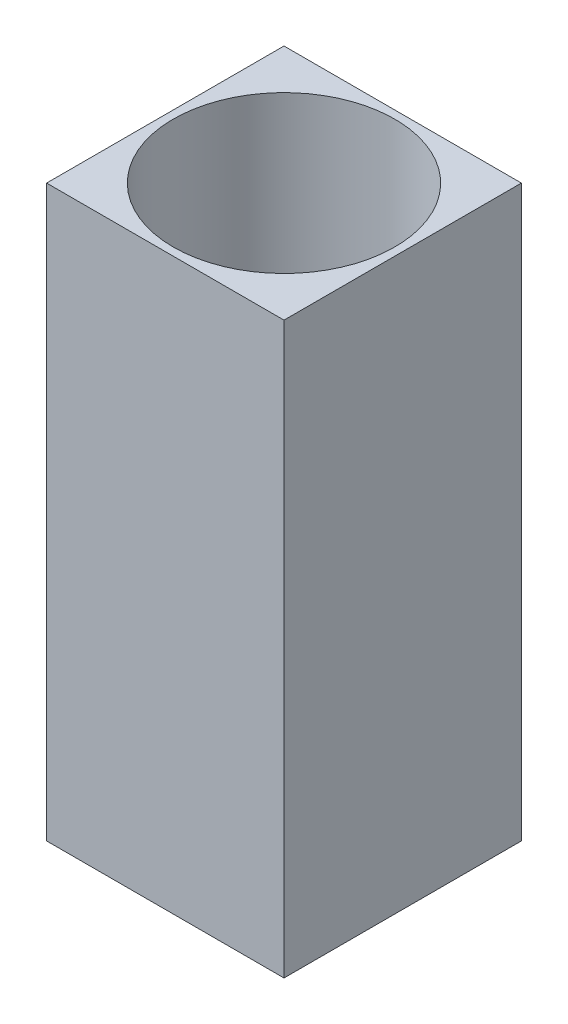
ISO-10303-21;
HEADER;
FILE_DESCRIPTION(('STEP AP214'),'2;1');
FILE_NAME('part.step','',(''),(''),'','','');
FILE_SCHEMA(('AUTOMOTIVE_DESIGN { 1 0 10303 214 1 1 1 1 }'));
ENDSEC;
DATA;
#1=APPLICATION_CONTEXT('core data for automotive mechanical design processes');
#2=APPLICATION_PROTOCOL_DEFINITION('international standard','automotive_design',2000,#1);
#3=PRODUCT_CONTEXT('',#1,'mechanical');
#4=PRODUCT('Part','Part','',(#3));
#5=PRODUCT_RELATED_PRODUCT_CATEGORY('part','',(#4));
#6=PRODUCT_DEFINITION_FORMATION('','',#4);
#7=PRODUCT_DEFINITION_CONTEXT('part definition',#1,'design');
#8=PRODUCT_DEFINITION('design','',#6,#7);
#9=PRODUCT_DEFINITION_SHAPE('','',#8);
#10=(LENGTH_UNIT() NAMED_UNIT(*) SI_UNIT(.MILLI.,.METRE.));
#11=(NAMED_UNIT(*) PLANE_ANGLE_UNIT() SI_UNIT($,.RADIAN.));
#12=(NAMED_UNIT(*) SI_UNIT($,.STERADIAN.) SOLID_ANGLE_UNIT());
#13=UNCERTAINTY_MEASURE_WITH_UNIT(LENGTH_MEASURE(1.E-05),#10,'distance_accuracy_value','');
#14=(GEOMETRIC_REPRESENTATION_CONTEXT(3) GLOBAL_UNCERTAINTY_ASSIGNED_CONTEXT((#13)) GLOBAL_UNIT_ASSIGNED_CONTEXT((#10,
#11,#12)) REPRESENTATION_CONTEXT('',''));
#15=CARTESIAN_POINT('',(0.,0.,0.));
#16=DIRECTION('',(0.,0.,1.));
#17=DIRECTION('',(1.,0.,0.));
#18=AXIS2_PLACEMENT_3D('',#15,#16,#17);
#19=CARTESIAN_POINT('',(0.,215.9,0.));
#20=DIRECTION('',(1.,0.,0.));
#21=DIRECTION('',(0.,0.,-1.));
#22=AXIS2_PLACEMENT_3D('',#19,#20,#21);
#23=PLANE('',#22);
#24=DIRECTION('',(0.,-1.,0.));
#25=VECTOR('',#24,1.);
#26=CARTESIAN_POINT('',(0.,215.9,-95.25));
#27=LINE('',#26,#25);
#28=CARTESIAN_POINT('',(0.,222.25,-95.25));
#29=VERTEX_POINT('',#28);
#30=CARTESIAN_POINT('',(0.,-6.35,-95.25));
#31=VERTEX_POINT('',#30);
#32=EDGE_CURVE('E76',#29,#31,#27,.T.);
#33=ORIENTED_EDGE('',*,*,#32,.T.);
#34=DIRECTION('',(0.,0.,-1.));
#35=VECTOR('',#34,1.);
#36=CARTESIAN_POINT('',(0.,-6.35,0.));
#37=LINE('',#36,#35);
#38=CARTESIAN_POINT('',(0.,-6.35,0.));
#39=VERTEX_POINT('',#38);
#40=EDGE_CURVE('E107',#39,#31,#37,.T.);
#41=ORIENTED_EDGE('',*,*,#40,.F.);
#42=DIRECTION('',(0.,-1.,0.));
#43=VECTOR('',#42,1.);
#44=CARTESIAN_POINT('',(0.,215.9,0.));
#45=LINE('',#44,#43);
#46=CARTESIAN_POINT('',(0.,222.25,0.));
#47=VERTEX_POINT('',#46);
#48=EDGE_CURVE('E11',#47,#39,#45,.T.);
#49=ORIENTED_EDGE('',*,*,#48,.F.);
#50=DIRECTION('',(0.,0.,1.));
#51=VECTOR('',#50,1.);
#52=CARTESIAN_POINT('',(0.,222.25,-95.25));
#53=LINE('',#52,#51);
#54=EDGE_CURVE('E86',#29,#47,#53,.T.);
#55=ORIENTED_EDGE('',*,*,#54,.F.);
#56=EDGE_LOOP('',(#33,#41,#49,#55));
#57=FACE_BOUND('',#56,.T.);
#58=ADVANCED_FACE('F39',(#57),#23,.F.);
#59=CARTESIAN_POINT('',(0.,215.9,0.));
#60=DIRECTION('',(0.,0.,-1.));
#61=DIRECTION('',(-1.,0.,0.));
#62=AXIS2_PLACEMENT_3D('',#59,#60,#61);
#63=PLANE('',#62);
#64=ORIENTED_EDGE('',*,*,#48,.T.);
#65=DIRECTION('',(-1.,0.,0.));
#66=VECTOR('',#65,1.);
#67=CARTESIAN_POINT('',(95.25,-6.35,0.));
#68=LINE('',#67,#66);
#69=CARTESIAN_POINT('',(95.25,-6.35,0.));
#70=VERTEX_POINT('',#69);
#71=EDGE_CURVE('E104',#70,#39,#68,.T.);
#72=ORIENTED_EDGE('',*,*,#71,.F.);
#73=DIRECTION('',(0.,-1.,0.));
#74=VECTOR('',#73,1.);
#75=CARTESIAN_POINT('',(95.25,215.9,0.));
#76=LINE('',#75,#74);
#77=CARTESIAN_POINT('',(95.25,222.25,0.));
#78=VERTEX_POINT('',#77);
#79=EDGE_CURVE('E46',#78,#70,#76,.T.);
#80=ORIENTED_EDGE('',*,*,#79,.F.);
#81=DIRECTION('',(1.,0.,0.));
#82=VECTOR('',#81,1.);
#83=CARTESIAN_POINT('',(0.,222.25,0.));
#84=LINE('',#83,#82);
#85=EDGE_CURVE('E95',#47,#78,#84,.T.);
#86=ORIENTED_EDGE('',*,*,#85,.F.);
#87=EDGE_LOOP('',(#64,#72,#80,#86));
#88=FACE_BOUND('',#87,.T.);
#89=ADVANCED_FACE('F138',(#88),#63,.F.);
#90=CARTESIAN_POINT('',(95.25,215.9,0.));
#91=DIRECTION('',(-1.,0.,0.));
#92=DIRECTION('',(0.,0.,1.));
#93=AXIS2_PLACEMENT_3D('',#90,#91,#92);
#94=PLANE('',#93);
#95=ORIENTED_EDGE('',*,*,#79,.T.);
#96=DIRECTION('',(0.,0.,1.));
#97=VECTOR('',#96,1.);
#98=CARTESIAN_POINT('',(95.25,-6.35,-95.25));
#99=LINE('',#98,#97);
#100=CARTESIAN_POINT('',(95.25,-6.35,-95.25));
#101=VERTEX_POINT('',#100);
#102=EDGE_CURVE('E112',#101,#70,#99,.T.);
#103=ORIENTED_EDGE('',*,*,#102,.F.);
#104=DIRECTION('',(0.,-1.,0.));
#105=VECTOR('',#104,1.);
#106=CARTESIAN_POINT('',(95.25,215.9,-95.25));
#107=LINE('',#106,#105);
#108=CARTESIAN_POINT('',(95.25,222.25,-95.25));
#109=VERTEX_POINT('',#108);
#110=EDGE_CURVE('E58',#109,#101,#107,.T.);
#111=ORIENTED_EDGE('',*,*,#110,.F.);
#112=DIRECTION('',(0.,0.,-1.));
#113=VECTOR('',#112,1.);
#114=CARTESIAN_POINT('',(95.25,222.25,0.));
#115=LINE('',#114,#113);
#116=EDGE_CURVE('E100',#78,#109,#115,.T.);
#117=ORIENTED_EDGE('',*,*,#116,.F.);
#118=EDGE_LOOP('',(#95,#103,#111,#117));
#119=FACE_BOUND('',#118,.T.);
#120=ADVANCED_FACE('F139',(#119),#94,.F.);
#121=CARTESIAN_POINT('',(0.,215.9,-95.25));
#122=DIRECTION('',(0.,0.,1.));
#123=DIRECTION('',(1.,0.,0.));
#124=AXIS2_PLACEMENT_3D('',#121,#122,#123);
#125=PLANE('',#124);
#126=ORIENTED_EDGE('',*,*,#110,.T.);
#127=DIRECTION('',(1.,0.,0.));
#128=VECTOR('',#127,1.);
#129=CARTESIAN_POINT('',(0.,-6.35,-95.25));
#130=LINE('',#129,#128);
#131=EDGE_CURVE('E83',#31,#101,#130,.T.);
#132=ORIENTED_EDGE('',*,*,#131,.F.);
#133=ORIENTED_EDGE('',*,*,#32,.F.);
#134=DIRECTION('',(-1.,0.,0.));
#135=VECTOR('',#134,1.);
#136=CARTESIAN_POINT('',(95.25,222.25,-95.25));
#137=LINE('',#136,#135);
#138=EDGE_CURVE('E80',#109,#29,#137,.T.);
#139=ORIENTED_EDGE('',*,*,#138,.F.);
#140=EDGE_LOOP('',(#126,#132,#133,#139));
#141=FACE_BOUND('',#140,.T.);
#142=ADVANCED_FACE('F79',(#141),#125,.F.);
#143=CARTESIAN_POINT('',(0.,-6.35,0.));
#144=DIRECTION('',(0.,-1.,0.));
#145=DIRECTION('',(0.,0.,-1.));
#146=AXIS2_PLACEMENT_3D('',#143,#144,#145);
#147=PLANE('',#146);
#148=ORIENTED_EDGE('',*,*,#71,.T.);
#149=ORIENTED_EDGE('',*,*,#40,.T.);
#150=ORIENTED_EDGE('',*,*,#131,.T.);
#151=ORIENTED_EDGE('',*,*,#102,.T.);
#152=EDGE_LOOP('',(#148,#149,#150,#151));
#153=FACE_BOUND('',#152,.T.);
#154=ADVANCED_FACE('F124',(#153),#147,.T.);
#155=CARTESIAN_POINT('',(0.,222.25,0.));
#156=DIRECTION('',(0.,1.,0.));
#157=DIRECTION('',(0.,0.,1.));
#158=AXIS2_PLACEMENT_3D('',#155,#156,#157);
#159=PLANE('',#158);
#160=ORIENTED_EDGE('',*,*,#138,.T.);
#161=ORIENTED_EDGE('',*,*,#54,.T.);
#162=ORIENTED_EDGE('',*,*,#85,.T.);
#163=ORIENTED_EDGE('',*,*,#116,.T.);
#164=EDGE_LOOP('',(#160,#161,#162,#163));
#165=FACE_BOUND('',#164,.T.);
#166=CARTESIAN_POINT('',(47.625,222.25,-47.625));
#167=DIRECTION('',(0.,1.,0.));
#168=DIRECTION('',(0.,0.,1.));
#169=AXIS2_PLACEMENT_3D('',#166,#167,#168);
#170=CIRCLE('',#169,44.45);
#171=CARTESIAN_POINT('',(47.625,222.25,-3.17499999999998));
#172=VERTEX_POINT('',#171);
#173=EDGE_CURVE('E98',#172,#172,#170,.T.);
#174=ORIENTED_EDGE('',*,*,#173,.F.);
#175=EDGE_LOOP('',(#174));
#176=FACE_BOUND('',#175,.T.);
#177=ADVANCED_FACE('F92',(#165,#176),#159,.T.);
#178=CARTESIAN_POINT('',(0.,0.,0.));
#179=DIRECTION('',(0.,-1.,0.));
#180=DIRECTION('',(0.,0.,-1.));
#181=AXIS2_PLACEMENT_3D('',#178,#179,#180);
#182=PLANE('',#181);
#183=CARTESIAN_POINT('',(47.625,0.,-47.625));
#184=DIRECTION('',(0.,1.,0.));
#185=DIRECTION('',(0.,0.,1.));
#186=AXIS2_PLACEMENT_3D('',#183,#184,#185);
#187=CIRCLE('',#186,44.45);
#188=CARTESIAN_POINT('',(47.625,0.,-3.17499999999998));
#189=VERTEX_POINT('',#188);
#190=EDGE_CURVE('E84',#189,#189,#187,.T.);
#191=ORIENTED_EDGE('',*,*,#190,.T.);
#192=EDGE_LOOP('',(#191));
#193=FACE_BOUND('',#192,.T.);
#194=ADVANCED_FACE('F117',(#193),#182,.F.);
#195=CARTESIAN_POINT('',(47.625,215.9,-47.625));
#196=DIRECTION('',(0.,-1.,0.));
#197=DIRECTION('',(0.,0.,-1.));
#198=AXIS2_PLACEMENT_3D('',#195,#196,#197);
#199=CYLINDRICAL_SURFACE('',#198,44.45);
#200=ORIENTED_EDGE('',*,*,#190,.F.);
#201=EDGE_LOOP('',(#200));
#202=FACE_BOUND('',#201,.T.);
#203=ORIENTED_EDGE('',*,*,#173,.T.);
#204=EDGE_LOOP('',(#203));
#205=FACE_BOUND('',#204,.T.);
#206=ADVANCED_FACE('F118',(#202,#205),#199,.F.);
#207=CLOSED_SHELL('',(#58,#89,#120,#142,#154,#177,#194,#206));
#208=MANIFOLD_SOLID_BREP('B2',#207);
#209=ADVANCED_BREP_SHAPE_REPRESENTATION('',(#18,#208),#14);
#210=SHAPE_DEFINITION_REPRESENTATION(#9,#209);
ENDSEC;
END-ISO-10303-21;
